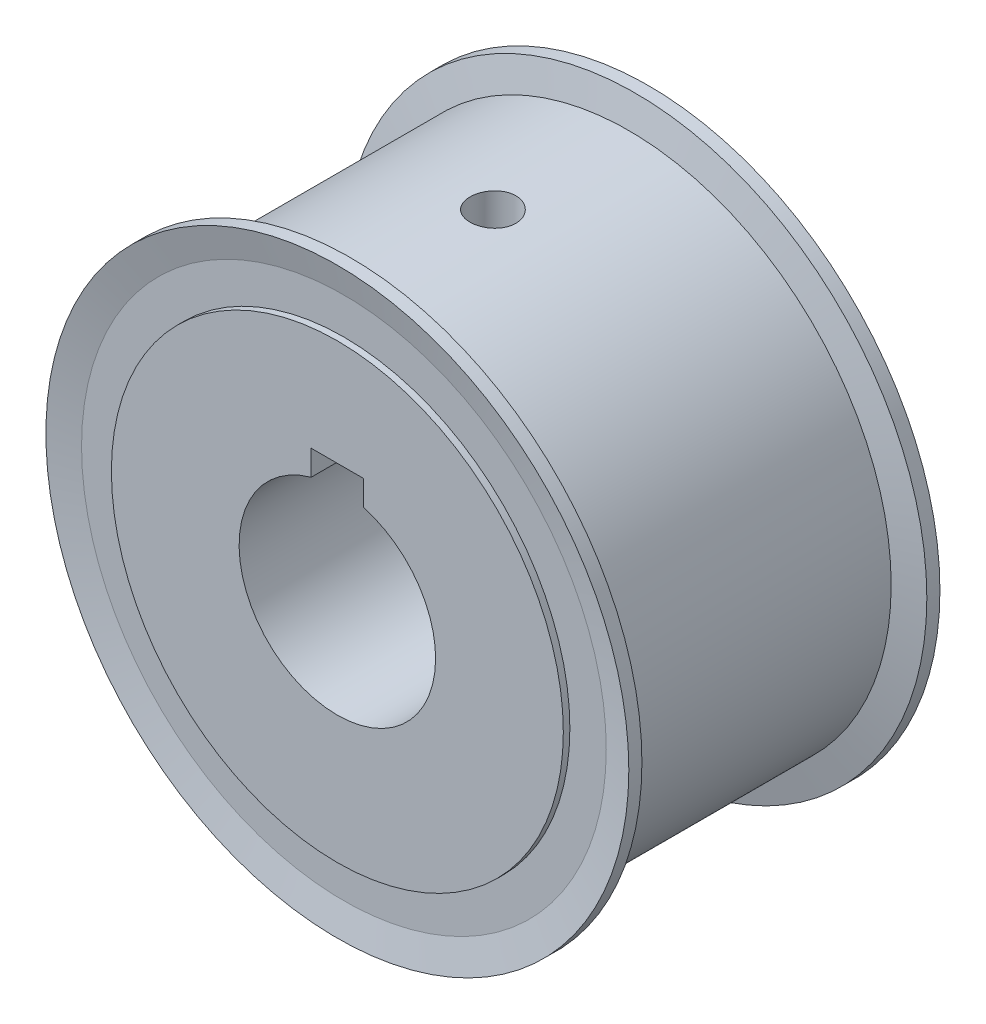
ISO-10303-21;
HEADER;
FILE_DESCRIPTION(('STEP AP214'),'2;1');
FILE_NAME('part.step','',(''),(''),'','','');
FILE_SCHEMA(('AUTOMOTIVE_DESIGN { 1 0 10303 214 1 1 1 1 }'));
ENDSEC;
DATA;
#1=APPLICATION_CONTEXT('core data for automotive mechanical design processes');
#2=APPLICATION_PROTOCOL_DEFINITION('international standard','automotive_design',2000,#1);
#3=PRODUCT_CONTEXT('',#1,'mechanical');
#4=PRODUCT('Part','Part','',(#3));
#5=PRODUCT_RELATED_PRODUCT_CATEGORY('part','',(#4));
#6=PRODUCT_DEFINITION_FORMATION('','',#4);
#7=PRODUCT_DEFINITION_CONTEXT('part definition',#1,'design');
#8=PRODUCT_DEFINITION('design','',#6,#7);
#9=PRODUCT_DEFINITION_SHAPE('','',#8);
#10=(LENGTH_UNIT() NAMED_UNIT(*) SI_UNIT(.MILLI.,.METRE.));
#11=(NAMED_UNIT(*) PLANE_ANGLE_UNIT() SI_UNIT($,.RADIAN.));
#12=(NAMED_UNIT(*) SI_UNIT($,.STERADIAN.) SOLID_ANGLE_UNIT());
#13=UNCERTAINTY_MEASURE_WITH_UNIT(LENGTH_MEASURE(1.E-05),#10,'distance_accuracy_value','');
#14=(GEOMETRIC_REPRESENTATION_CONTEXT(3) GLOBAL_UNCERTAINTY_ASSIGNED_CONTEXT((#13)) GLOBAL_UNIT_ASSIGNED_CONTEXT((#10,
#11,#12)) REPRESENTATION_CONTEXT('',''));
#15=CARTESIAN_POINT('',(0.,0.,0.));
#16=DIRECTION('',(0.,0.,1.));
#17=DIRECTION('',(1.,0.,0.));
#18=AXIS2_PLACEMENT_3D('',#15,#16,#17);
#19=CARTESIAN_POINT('',(-26.0283935107412,-15.0275000000001,23.75));
#20=DIRECTION('',(0.866025403784436,0.500000000000004,0.));
#21=DIRECTION('',(-0.500000000000004,0.866025403784436,0.));
#22=AXIS2_PLACEMENT_3D('',#19,#20,#21);
#23=PLANE('',#22);
#24=CARTESIAN_POINT('',(-26.0283935107412,-15.0275000000001,23.75));
#25=DIRECTION('',(-0.866025403784436,-0.500000000000004,0.));
#26=DIRECTION('',(0.500000000000004,-0.866025403784436,0.));
#27=AXIS2_PLACEMENT_3D('',#24,#25,#26);
#28=CIRCLE('',#27,3.5);
#29=CARTESIAN_POINT('',(-24.2783935107412,-18.0585889132456,23.75));
#30=VERTEX_POINT('',#29);
#31=EDGE_CURVE('E219',#30,#30,#28,.T.);
#32=ORIENTED_EDGE('',*,*,#31,.T.);
#33=EDGE_LOOP('',(#32));
#34=FACE_BOUND('',#33,.T.);
#35=CARTESIAN_POINT('',(-26.0283935107412,-15.0275000000001,23.75));
#36=DIRECTION('',(-0.866025403784436,-0.500000000000004,0.));
#37=DIRECTION('',(0.500000000000004,-0.866025403784436,0.));
#38=AXIS2_PLACEMENT_3D('',#35,#36,#37);
#39=CIRCLE('',#38,2.49999999999999);
#40=CARTESIAN_POINT('',(-24.7783935107412,-17.1925635094612,23.75));
#41=VERTEX_POINT('',#40);
#42=EDGE_CURVE('E220',#41,#41,#39,.T.);
#43=ORIENTED_EDGE('',*,*,#42,.F.);
#44=EDGE_LOOP('',(#43));
#45=FACE_BOUND('',#44,.T.);
#46=ADVANCED_FACE('F34',(#34,#45),#23,.F.);
#47=CARTESIAN_POINT('',(0.,30.055,23.75));
#48=DIRECTION('',(0.,-1.,0.));
#49=DIRECTION('',(0.,0.,-1.));
#50=AXIS2_PLACEMENT_3D('',#47,#48,#49);
#51=PLANE('',#50);
#52=CARTESIAN_POINT('',(0.,30.055,23.75));
#53=DIRECTION('',(0.,1.,0.));
#54=DIRECTION('',(0.,0.,1.));
#55=AXIS2_PLACEMENT_3D('',#52,#53,#54);
#56=CIRCLE('',#55,3.5);
#57=CARTESIAN_POINT('',(0.,30.055,27.25));
#58=VERTEX_POINT('',#57);
#59=EDGE_CURVE('E228',#58,#58,#56,.T.);
#60=ORIENTED_EDGE('',*,*,#59,.T.);
#61=EDGE_LOOP('',(#60));
#62=FACE_BOUND('',#61,.T.);
#63=CARTESIAN_POINT('',(0.,30.055,23.75));
#64=DIRECTION('',(0.,1.,0.));
#65=DIRECTION('',(0.,0.,1.));
#66=AXIS2_PLACEMENT_3D('',#63,#64,#65);
#67=CIRCLE('',#66,2.49999999999999);
#68=CARTESIAN_POINT('',(0.,30.055,26.25));
#69=VERTEX_POINT('',#68);
#70=EDGE_CURVE('E222',#69,#69,#67,.T.);
#71=ORIENTED_EDGE('',*,*,#70,.F.);
#72=EDGE_LOOP('',(#71));
#73=FACE_BOUND('',#72,.T.);
#74=ADVANCED_FACE('F157',(#62,#73),#51,.F.);
#75=CARTESIAN_POINT('',(0.,34.5,47.5));
#76=DIRECTION('',(0.,0.,-1.));
#77=DIRECTION('',(-1.,0.,0.));
#78=AXIS2_PLACEMENT_3D('',#75,#76,#77);
#79=PLANE('',#78);
#80=CARTESIAN_POINT('',(0.,0.,47.5));
#81=DIRECTION('',(0.,0.,-1.));
#82=DIRECTION('',(-1.,0.,0.));
#83=AXIS2_PLACEMENT_3D('',#80,#81,#82);
#84=CIRCLE('',#83,15.);
#85=CARTESIAN_POINT('',(4.,14.456832294801,47.5));
#86=VERTEX_POINT('',#85);
#87=CARTESIAN_POINT('',(-4.,14.456832294801,47.5));
#88=VERTEX_POINT('',#87);
#89=EDGE_CURVE('E102',#86,#88,#84,.T.);
#90=ORIENTED_EDGE('',*,*,#89,.T.);
#91=DIRECTION('',(0.,-1.,0.));
#92=VECTOR('',#91,1.);
#93=CARTESIAN_POINT('',(-4.,18.3,47.5));
#94=LINE('',#93,#92);
#95=CARTESIAN_POINT('',(-4.,18.3,47.5));
#96=VERTEX_POINT('',#95);
#97=EDGE_CURVE('E85',#96,#88,#94,.T.);
#98=ORIENTED_EDGE('',*,*,#97,.F.);
#99=DIRECTION('',(-1.,0.,0.));
#100=VECTOR('',#99,1.);
#101=CARTESIAN_POINT('',(-4.,18.3,47.5));
#102=LINE('',#101,#100);
#103=CARTESIAN_POINT('',(4.,18.3,47.5));
#104=VERTEX_POINT('',#103);
#105=EDGE_CURVE('E98',#104,#96,#102,.T.);
#106=ORIENTED_EDGE('',*,*,#105,.F.);
#107=DIRECTION('',(0.,1.,0.));
#108=VECTOR('',#107,1.);
#109=CARTESIAN_POINT('',(4.,18.3,47.5));
#110=LINE('',#109,#108);
#111=EDGE_CURVE('E234',#86,#104,#110,.T.);
#112=ORIENTED_EDGE('',*,*,#111,.F.);
#113=EDGE_LOOP('',(#90,#98,#106,#112));
#114=FACE_BOUND('',#113,.T.);
#115=CARTESIAN_POINT('',(0.,0.,47.5));
#116=DIRECTION('',(0.,0.,1.));
#117=DIRECTION('',(1.,0.,0.));
#118=AXIS2_PLACEMENT_3D('',#115,#116,#117);
#119=CIRCLE('',#118,34.5);
#120=CARTESIAN_POINT('',(34.5,0.,47.5));
#121=VERTEX_POINT('',#120);
#122=EDGE_CURVE('E101',#121,#121,#119,.T.);
#123=ORIENTED_EDGE('',*,*,#122,.T.);
#124=EDGE_LOOP('',(#123));
#125=FACE_BOUND('',#124,.T.);
#126=ADVANCED_FACE('F36',(#114,#125),#79,.F.);
#127=CARTESIAN_POINT('',(0.,34.5,0.));
#128=DIRECTION('',(0.,0.,1.));
#129=DIRECTION('',(1.,0.,0.));
#130=AXIS2_PLACEMENT_3D('',#127,#128,#129);
#131=PLANE('',#130);
#132=DIRECTION('',(-1.,0.,0.));
#133=VECTOR('',#132,1.);
#134=CARTESIAN_POINT('',(-4.,18.3,0.));
#135=LINE('',#134,#133);
#136=CARTESIAN_POINT('',(4.,18.3,0.));
#137=VERTEX_POINT('',#136);
#138=CARTESIAN_POINT('',(-4.,18.3,0.));
#139=VERTEX_POINT('',#138);
#140=EDGE_CURVE('E91',#137,#139,#135,.T.);
#141=ORIENTED_EDGE('',*,*,#140,.T.);
#142=DIRECTION('',(0.,-1.,0.));
#143=VECTOR('',#142,1.);
#144=CARTESIAN_POINT('',(-4.,18.3,0.));
#145=LINE('',#144,#143);
#146=CARTESIAN_POINT('',(-4.,14.456832294801,0.));
#147=VERTEX_POINT('',#146);
#148=EDGE_CURVE('E82',#139,#147,#145,.T.);
#149=ORIENTED_EDGE('',*,*,#148,.T.);
#150=CARTESIAN_POINT('',(0.,0.,0.));
#151=DIRECTION('',(0.,0.,-1.));
#152=DIRECTION('',(-1.,0.,0.));
#153=AXIS2_PLACEMENT_3D('',#150,#151,#152);
#154=CIRCLE('',#153,15.);
#155=CARTESIAN_POINT('',(4.,14.456832294801,0.));
#156=VERTEX_POINT('',#155);
#157=EDGE_CURVE('E97',#156,#147,#154,.T.);
#158=ORIENTED_EDGE('',*,*,#157,.F.);
#159=DIRECTION('',(0.,1.,0.));
#160=VECTOR('',#159,1.);
#161=CARTESIAN_POINT('',(4.,18.3,0.));
#162=LINE('',#161,#160);
#163=EDGE_CURVE('E53',#156,#137,#162,.T.);
#164=ORIENTED_EDGE('',*,*,#163,.T.);
#165=EDGE_LOOP('',(#141,#149,#158,#164));
#166=FACE_BOUND('',#165,.T.);
#167=CARTESIAN_POINT('',(0.,0.,0.));
#168=DIRECTION('',(0.,0.,1.));
#169=DIRECTION('',(1.,0.,0.));
#170=AXIS2_PLACEMENT_3D('',#167,#168,#169);
#171=CIRCLE('',#170,34.5);
#172=CARTESIAN_POINT('',(34.5,0.,0.));
#173=VERTEX_POINT('',#172);
#174=EDGE_CURVE('E138',#173,#173,#171,.T.);
#175=ORIENTED_EDGE('',*,*,#174,.F.);
#176=EDGE_LOOP('',(#175));
#177=FACE_BOUND('',#176,.T.);
#178=ADVANCED_FACE('F95',(#166,#177),#131,.F.);
#179=CARTESIAN_POINT('',(0.,0.,52.8569404790386));
#180=DIRECTION('',(0.,0.,1.));
#181=DIRECTION('',(1.,0.,0.));
#182=AXIS2_PLACEMENT_3D('',#179,#180,#181);
#183=CYLINDRICAL_SURFACE('',#182,34.5);
#184=CARTESIAN_POINT('',(0.,0.,1.));
#185=DIRECTION('',(0.,0.,1.));
#186=DIRECTION('',(1.,0.,0.));
#187=AXIS2_PLACEMENT_3D('',#184,#185,#186);
#188=CIRCLE('',#187,34.5);
#189=CARTESIAN_POINT('',(34.5,0.,1.));
#190=VERTEX_POINT('',#189);
#191=EDGE_CURVE('E135',#190,#190,#188,.T.);
#192=ORIENTED_EDGE('',*,*,#191,.F.);
#193=EDGE_LOOP('',(#192));
#194=FACE_BOUND('',#193,.T.);
#195=ORIENTED_EDGE('',*,*,#174,.T.);
#196=EDGE_LOOP('',(#195));
#197=FACE_BOUND('',#196,.T.);
#198=ADVANCED_FACE('F257',(#194,#197),#183,.T.);
#199=CARTESIAN_POINT('',(0.,40.055,1.));
#200=DIRECTION('',(0.,0.,1.));
#201=DIRECTION('',(1.,0.,0.));
#202=AXIS2_PLACEMENT_3D('',#199,#200,#201);
#203=PLANE('',#202);
#204=CARTESIAN_POINT('',(0.,0.,1.));
#205=DIRECTION('',(0.,0.,1.));
#206=DIRECTION('',(1.,0.,0.));
#207=AXIS2_PLACEMENT_3D('',#204,#205,#206);
#208=CIRCLE('',#207,40.055);
#209=CARTESIAN_POINT('',(40.055,0.,1.));
#210=VERTEX_POINT('',#209);
#211=EDGE_CURVE('E132',#210,#210,#208,.T.);
#212=ORIENTED_EDGE('',*,*,#211,.F.);
#213=EDGE_LOOP('',(#212));
#214=FACE_BOUND('',#213,.T.);
#215=ORIENTED_EDGE('',*,*,#191,.T.);
#216=EDGE_LOOP('',(#215));
#217=FACE_BOUND('',#216,.T.);
#218=ADVANCED_FACE('F261',(#214,#217),#203,.F.);
#219=CARTESIAN_POINT('',(0.,0.,1.));
#220=DIRECTION('',(0.,0.,-1.));
#221=DIRECTION('',(-1.,0.,0.));
#222=AXIS2_PLACEMENT_3D('',#219,#220,#221);
#223=CONICAL_SURFACE('',#222,40.055,1.34950865104239);
#224=CARTESIAN_POINT('',(0.,0.,0.));
#225=DIRECTION('',(0.,0.,1.));
#226=DIRECTION('',(1.,0.,0.));
#227=AXIS2_PLACEMENT_3D('',#224,#225,#226);
#228=CIRCLE('',#227,44.5);
#229=CARTESIAN_POINT('',(44.5,0.,0.));
#230=VERTEX_POINT('',#229);
#231=EDGE_CURVE('E129',#230,#230,#228,.T.);
#232=ORIENTED_EDGE('',*,*,#231,.F.);
#233=EDGE_LOOP('',(#232));
#234=FACE_BOUND('',#233,.T.);
#235=ORIENTED_EDGE('',*,*,#211,.T.);
#236=EDGE_LOOP('',(#235));
#237=FACE_BOUND('',#236,.T.);
#238=ADVANCED_FACE('F267',(#234,#237),#223,.F.);
#239=CARTESIAN_POINT('',(0.,0.,52.8569404790386));
#240=DIRECTION('',(0.,0.,1.));
#241=DIRECTION('',(1.,0.,0.));
#242=AXIS2_PLACEMENT_3D('',#239,#240,#241);
#243=CYLINDRICAL_SURFACE('',#242,44.5);
#244=CARTESIAN_POINT('',(0.,0.,2.));
#245=DIRECTION('',(0.,0.,1.));
#246=DIRECTION('',(1.,0.,0.));
#247=AXIS2_PLACEMENT_3D('',#244,#245,#246);
#248=CIRCLE('',#247,44.5);
#249=CARTESIAN_POINT('',(44.5,0.,2.));
#250=VERTEX_POINT('',#249);
#251=EDGE_CURVE('E126',#250,#250,#248,.T.);
#252=ORIENTED_EDGE('',*,*,#251,.F.);
#253=EDGE_LOOP('',(#252));
#254=FACE_BOUND('',#253,.T.);
#255=ORIENTED_EDGE('',*,*,#231,.T.);
#256=EDGE_LOOP('',(#255));
#257=FACE_BOUND('',#256,.T.);
#258=ADVANCED_FACE('F271',(#254,#257),#243,.T.);
#259=CARTESIAN_POINT('',(0.,0.,2.));
#260=DIRECTION('',(0.,0.,-1.));
#261=DIRECTION('',(-1.,0.,0.));
#262=AXIS2_PLACEMENT_3D('',#259,#260,#261);
#263=CONICAL_SURFACE('',#262,44.5,1.34950865104239);
#264=CARTESIAN_POINT('',(0.,0.,3.));
#265=DIRECTION('',(0.,0.,1.));
#266=DIRECTION('',(1.,0.,0.));
#267=AXIS2_PLACEMENT_3D('',#264,#265,#266);
#268=CIRCLE('',#267,40.055);
#269=CARTESIAN_POINT('',(40.055,0.,3.));
#270=VERTEX_POINT('',#269);
#271=EDGE_CURVE('E123',#270,#270,#268,.T.);
#272=ORIENTED_EDGE('',*,*,#271,.F.);
#273=EDGE_LOOP('',(#272));
#274=FACE_BOUND('',#273,.T.);
#275=ORIENTED_EDGE('',*,*,#251,.T.);
#276=EDGE_LOOP('',(#275));
#277=FACE_BOUND('',#276,.T.);
#278=ADVANCED_FACE('F193',(#274,#277),#263,.T.);
#279=CARTESIAN_POINT('',(0.,0.,52.8569404790386));
#280=DIRECTION('',(0.,0.,1.));
#281=DIRECTION('',(1.,0.,0.));
#282=AXIS2_PLACEMENT_3D('',#279,#280,#281);
#283=CYLINDRICAL_SURFACE('',#282,40.055);
#284=CARTESIAN_POINT('',(-32.80596574761,-22.9819850397358,23.75));
#285=CARTESIAN_POINT('',(-32.8059717786235,-22.9819786432278,23.553806520305));
#286=CARTESIAN_POINT('',(-32.815508394242,-22.9683818484388,23.3574803431471));
#287=CARTESIAN_POINT('',(-32.8533061019263,-22.9142826619368,22.9702625894534));
#288=CARTESIAN_POINT('',(-32.8815882789119,-22.8737499727209,22.7793773853586));
#289=CARTESIAN_POINT('',(-32.955740739866,-22.7667825362345,22.4087056791033));
#290=CARTESIAN_POINT('',(-33.0016008961903,-22.700362703606,22.2289128551321));
#291=CARTESIAN_POINT('',(-33.1091148851442,-22.5432595972545,21.8854248458655));
#292=CARTESIAN_POINT('',(-33.1707653955218,-22.452581427248,21.7217262843903));
#293=CARTESIAN_POINT('',(-33.3077099727427,-22.2489220439223,21.4145718856317));
#294=CARTESIAN_POINT('',(-33.3830376650998,-22.1358858004051,21.2711675234144));
#295=CARTESIAN_POINT('',(-33.5444808846166,-21.8904626832845,21.0091147256924));
#296=CARTESIAN_POINT('',(-33.6305968877928,-21.7580749557854,20.8904673831669));
#297=CARTESIAN_POINT('',(-33.8107281338238,-21.4770933596427,20.6811235292922));
#298=CARTESIAN_POINT('',(-33.9047557389747,-21.3284740160772,20.5904718348179));
#299=CARTESIAN_POINT('',(-34.097407909731,-21.0191096116076,20.4399792172312));
#300=CARTESIAN_POINT('',(-34.1960323877068,-20.8583647818141,20.3801377070495));
#301=CARTESIAN_POINT('',(-34.3944439044734,-20.5295400015305,20.2931130777752));
#302=CARTESIAN_POINT('',(-34.4942272988422,-20.3614799895973,20.2658463204221));
#303=CARTESIAN_POINT('',(-34.6921851586057,-20.022333986653,20.2444865915869));
#304=CARTESIAN_POINT('',(-34.7903596565515,-19.8512480570078,20.2503929481179));
#305=CARTESIAN_POINT('',(-34.9820721930106,-19.5114227620504,20.2951435023052));
#306=CARTESIAN_POINT('',(-35.0756221542238,-19.3426782667891,20.3338977609611));
#307=CARTESIAN_POINT('',(-35.2559686991743,-19.0119750106855,20.4431041207878));
#308=CARTESIAN_POINT('',(-35.342765213252,-18.8500163198445,20.5135565488639));
#309=CARTESIAN_POINT('',(-35.5076955051724,-18.5374724450026,20.6842592328285));
#310=CARTESIAN_POINT('',(-35.5858174083991,-18.3869029392594,20.7845496597134));
#311=CARTESIAN_POINT('',(-35.7316290834878,-18.101916250953,21.0120522973215));
#312=CARTESIAN_POINT('',(-35.7993186223172,-17.9674994292145,21.1392651092716));
#313=CARTESIAN_POINT('',(-35.9232022302373,-17.7185216865187,21.4175080703633));
#314=CARTESIAN_POINT('',(-35.9793571282736,-17.6040286203667,21.5686163907751));
#315=CARTESIAN_POINT('',(-36.0789286685636,-17.3990505021577,21.8900888502207));
#316=CARTESIAN_POINT('',(-36.1223452987356,-17.308565472871,22.0604530075175));
#317=CARTESIAN_POINT('',(-36.195767112707,-17.1544976129405,22.4156573154005));
#318=CARTESIAN_POINT('',(-36.2257704008454,-17.090918584896,22.6004995077817));
#319=CARTESIAN_POINT('',(-36.2719154320454,-16.9927673797377,22.9793858567227));
#320=CARTESIAN_POINT('',(-36.2880574959564,-16.9581945312104,23.1734298001774));
#321=CARTESIAN_POINT('',(-36.3062233324763,-16.9192683452595,23.5645253576344));
#322=CARTESIAN_POINT('',(-36.3082935594854,-16.9148155747022,23.7615649209949));
#323=CARTESIAN_POINT('',(-36.2984104160125,-16.9360136305501,24.153661129507));
#324=CARTESIAN_POINT('',(-36.2864571895543,-16.9616641477883,24.3487177950025));
#325=CARTESIAN_POINT('',(-36.2487240228112,-17.042153087416,24.7309962832855));
#326=CARTESIAN_POINT('',(-36.2229660643406,-17.0969451056003,24.91823005324));
#327=CARTESIAN_POINT('',(-36.1580061992833,-17.2339004158932,25.2799182445754));
#328=CARTESIAN_POINT('',(-36.1188040559442,-17.3160641900182,25.4543724408421));
#329=CARTESIAN_POINT('',(-36.0274299216028,-17.5053806782556,25.786049267274));
#330=CARTESIAN_POINT('',(-35.9752243562673,-17.6125980347072,25.9432257487509));
#331=CARTESIAN_POINT('',(-35.8587553603285,-17.8485279781856,26.2354187117788));
#332=CARTESIAN_POINT('',(-35.7944917017468,-17.9772409716183,26.3704347742596));
#333=CARTESIAN_POINT('',(-35.6548835657263,-18.2525654564549,26.6148483691287));
#334=CARTESIAN_POINT('',(-35.5795092511139,-18.3992249564239,26.7241747957997));
#335=CARTESIAN_POINT('',(-35.4193490382875,-18.7056833659984,26.9136175410774));
#336=CARTESIAN_POINT('',(-35.3345632421424,-18.8654821331018,26.9937341764283));
#337=CARTESIAN_POINT('',(-35.1576337187789,-19.1931866267193,27.1223613758143));
#338=CARTESIAN_POINT('',(-35.0655003734094,-19.361080786499,27.1709156782745));
#339=CARTESIAN_POINT('',(-34.8760949463635,-19.7002215999761,27.2351828398488));
#340=CARTESIAN_POINT('',(-34.7788229726435,-19.8714681831956,27.2508963886273));
#341=CARTESIAN_POINT('',(-34.5821507306926,-20.2117880135438,27.2490275839308));
#342=CARTESIAN_POINT('',(-34.4827586295846,-20.3808665994154,27.231555946664));
#343=CARTESIAN_POINT('',(-34.2844690276536,-20.7126912939972,27.1640438976544));
#344=CARTESIAN_POINT('',(-34.1855715274458,-20.8754373948335,27.1140034454165));
#345=CARTESIAN_POINT('',(-33.9913859492601,-21.1901610106949,26.9828029719464));
#346=CARTESIAN_POINT('',(-33.8960976067405,-21.3421393156844,26.9016452363972));
#347=CARTESIAN_POINT('',(-33.7122730330013,-21.6313445954075,26.7105263897741));
#348=CARTESIAN_POINT('',(-33.6237367103657,-21.7685717698678,26.6005656687552));
#349=CARTESIAN_POINT('',(-33.4562032167059,-22.0251921685666,26.3545464751038));
#350=CARTESIAN_POINT('',(-33.3772373645831,-22.1445271281879,26.2184058996433));
#351=CARTESIAN_POINT('',(-33.2320122441175,-22.3618765300853,25.9240439366185));
#352=CARTESIAN_POINT('',(-33.1657560509849,-22.459885813201,25.7658172210844));
#353=CARTESIAN_POINT('',(-33.0483420892936,-22.6323009563495,25.4314377311704));
#354=CARTESIAN_POINT('',(-32.9972151240475,-22.7066586842242,25.2552493533699));
#355=CARTESIAN_POINT('',(-32.9122762296052,-22.8296021347531,24.8903249113287));
#356=CARTESIAN_POINT('',(-32.8784444795334,-22.8782173614445,24.7016034920107));
#357=CARTESIAN_POINT('',(-32.8380102082563,-22.9361904715862,24.3848154680584));
#358=CARTESIAN_POINT('',(-32.8260147946796,-22.9533434559431,24.2587836757226));
#359=CARTESIAN_POINT('',(-32.8099906147966,-22.9762428032755,24.0051866354448));
#360=CARTESIAN_POINT('',(-32.8059618245115,-22.9819892005839,23.8776213921196));
#361=CARTESIAN_POINT('',(-32.80596574761,-22.9819850397358,23.75));
#362=B_SPLINE_CURVE_WITH_KNOTS('',3,(#284,#285,#286,#287,#288,#289,#290,#291,#292,#293,#294,
#295,#296,#297,#298,#299,#300,#301,#302,#303,#304,#305,#306,#307,#308,#309,#310,#311,#312,#313,
#314,#315,#316,#317,#318,#319,#320,#321,#322,#323,#324,#325,#326,#327,#328,#329,#330,#331,#332,
#333,#334,#335,#336,#337,#338,#339,#340,#341,#342,#343,#344,#345,#346,#347,#348,#349,#350,#351,
#352,#353,#354,#355,#356,#357,#358,#359,#360,#361),.UNSPECIFIED.,.T.,.F.,(4,2,2,2,2,2,2,2,2,2,2,
2,2,2,2,2,2,2,2,2,2,2,2,2,2,2,2,2,2,2,2,2,2,2,2,2,2,2,4),(0.,0.588114451442172,1.17689153641607,
1.76532990308698,2.35364456532047,2.94342568816245,3.53323284330667,4.12397935545634,
4.71471461087383,5.30392982430115,5.89313310205305,6.48072830744088,7.06832957287399,
7.65672553547558,8.24513463944476,8.83551006738781,9.42588605526835,10.0163454525774,
10.6067911819933,11.195286762252,11.783776298593,12.3713315321509,12.9588971131025,
13.5479957836067,14.1371055931271,14.727827268104,15.3185425372446,15.908437450393,
16.4983199754716,17.0862379233888,17.6741566023088,18.2620321046322,18.8498996462552,
19.4396417902488,20.029526447884,20.6206039832322,21.2110025974347,21.5935648061716,
21.9761258634267),.UNSPECIFIED.);
#363=CARTESIAN_POINT('',(-32.80596574761,-22.9819850397358,23.75));
#364=VERTEX_POINT('',#363);
#365=EDGE_CURVE('E11',#364,#364,#362,.T.);
#366=ORIENTED_EDGE('',*,*,#365,.T.);
#367=EDGE_LOOP('',(#366));
#368=FACE_BOUND('',#367,.T.);
#369=CARTESIAN_POINT('',(0.,40.055,27.25));
#370=CARTESIAN_POINT('',(-0.196195091913983,40.0549980035695,27.2499914464052));
#371=CARTESIAN_POINT('',(-0.392522876083729,40.053543157102,27.2334477061984));
#372=CARTESIAN_POINT('',(-0.779743968807647,40.0478793688906,27.1676964441643));
#373=CARTESIAN_POINT('',(-0.970630906181819,40.0436673264563,27.1184521470103));
#374=CARTESIAN_POINT('',(-1.34130627711322,40.0329650107293,26.9887368536928));
#375=CARTESIAN_POINT('',(-1.52110101780322,40.0264760464205,26.9082837963965));
#376=CARTESIAN_POINT('',(-1.86459223730481,40.0119471087442,26.7184674782124));
#377=CARTESIAN_POINT('',(-2.02829209469687,40.0039074619445,26.6091103026272));
#378=CARTESIAN_POINT('',(-2.33544502461648,39.9871539055789,26.3642614714731));
#379=CARTESIAN_POINT('',(-2.47884703385911,39.9784383779752,26.2287058640499));
#380=CARTESIAN_POINT('',(-2.7408952918844,39.9613288852561,25.9354435817762));
#381=CARTESIAN_POINT('',(-2.85954044047289,39.952934934445,25.7777359230102));
#382=CARTESIAN_POINT('',(-3.0688820044522,39.9374018246309,25.4443343892415));
#383=CARTESIAN_POINT('',(-3.15953319883226,39.9302647038008,25.2686120170434));
#384=CARTESIAN_POINT('',(-3.31002476967342,39.9180722841311,24.9043675362292));
#385=CARTESIAN_POINT('',(-3.36986573916652,39.9130169452221,24.7158456740553));
#386=CARTESIAN_POINT('',(-3.45688923223841,39.905574350721,24.3318677418437));
#387=CARTESIAN_POINT('',(-3.48415534896616,39.9031802669561,24.1364307516151));
#388=CARTESIAN_POINT('',(-3.50551343161705,39.9013097721972,23.7437407068067));
#389=CARTESIAN_POINT('',(-3.49960607641087,39.9018333014964,23.546487689473));
#390=CARTESIAN_POINT('',(-3.45485394596231,39.9057326673437,23.1563385003557));
#391=CARTESIAN_POINT('',(-3.41610011487456,39.9091006282393,22.9634318070781));
#392=CARTESIAN_POINT('',(-3.30689645162769,39.9182970321075,22.5868715070693));
#393=CARTESIAN_POINT('',(-3.23644628293893,39.924125501204,22.4032179986049));
#394=CARTESIAN_POINT('',(-3.06574826713897,39.9375952651673,22.0500880674758));
#395=CARTESIAN_POINT('',(-2.96545972021031,39.9452390332258,21.8806314166929));
#396=CARTESIAN_POINT('',(-2.73796108962057,39.9614758979904,21.5609217047501));
#397=CARTESIAN_POINT('',(-2.61075040575157,39.9700690158594,21.4106690718485));
#398=CARTESIAN_POINT('',(-2.33250894803874,39.9872714030673,21.1331037957159));
#399=CARTESIAN_POINT('',(-2.18139956999274,39.9958806296535,21.0058699322082));
#400=CARTESIAN_POINT('',(-1.85992410214172,40.0121177392272,20.7785633437436));
#401=CARTESIAN_POINT('',(-1.68955799772269,40.01974562147,20.6784906393997));
#402=CARTESIAN_POINT('',(-1.33435317534095,40.0331622658078,20.5083515756488));
#403=CARTESIAN_POINT('',(-1.1495127222482,40.0389508069876,20.438288820254));
#404=CARTESIAN_POINT('',(-0.770630151931283,40.0480340991053,20.3302142182351));
#405=CARTESIAN_POINT('',(-0.576588244798591,40.0513289069521,20.2922016401998));
#406=CARTESIAN_POINT('',(-0.185493613972502,40.0550461933334,20.2494054666245));
#407=CARTESIAN_POINT('',(0.0115471194759136,40.0554780757476,20.2445130797368));
#408=CARTESIAN_POINT('',(0.403645923510567,40.0534459885363,20.2678110021149));
#409=CARTESIAN_POINT('',(0.59870401443846,40.0509820486519,20.2960009716137));
#410=CARTESIAN_POINT('',(0.980989488495527,40.0434414055186,20.3845732074668));
#411=CARTESIAN_POINT('',(1.16822866960278,40.0383688047786,20.4449049314504));
#412=CARTESIAN_POINT('',(1.52992703452426,40.0261805026754,20.5959963855795));
#413=CARTESIAN_POINT('',(1.70438599684771,40.0190647659137,20.6867566429223));
#414=CARTESIAN_POINT('',(2.03606603940723,40.0035640271791,20.8964013936464));
#415=CARTESIAN_POINT('',(2.19324149676179,39.995175798691,21.0153578249356));
#416=CARTESIAN_POINT('',(2.48543206981567,39.9780829424773,21.2779144447657));
#417=CARTESIAN_POINT('',(2.62044676199094,39.9693783087087,21.421515104186));
#418=CARTESIAN_POINT('',(2.86485744027774,39.9526057642994,21.7297565656509));
#419=CARTESIAN_POINT('',(2.97418234056156,39.9445396604355,21.8944538450262));
#420=CARTESIAN_POINT('',(3.16362240684723,39.9299835176486,22.2399328553339));
#421=CARTESIAN_POINT('',(3.24373788924878,39.9234934616538,22.4207144120132));
#422=CARTESIAN_POINT('',(3.37236431636771,39.9128346824393,22.792980341534));
#423=CARTESIAN_POINT('',(3.42091850009857,39.9086627844837,22.9844496796788));
#424=CARTESIAN_POINT('',(3.48518472672618,39.9031022523147,23.3728612897795));
#425=CARTESIAN_POINT('',(3.5008974702538,39.9017135587252,23.5698034448889));
#426=CARTESIAN_POINT('',(3.49902633524599,39.9018776307166,23.9628637668256));
#427=CARTESIAN_POINT('',(3.48155414094391,39.9034205299998,24.1589824790814));
#428=CARTESIAN_POINT('',(3.41404227642055,39.9092529630346,24.5454883793592));
#429=CARTESIAN_POINT('',(3.36400255915971,39.9135425007532,24.7358755591023));
#430=CARTESIAN_POINT('',(3.23280497931036,39.9243822612601,25.1055193884438));
#431=CARTESIAN_POINT('',(3.15164942767604,39.9309323161575,25.2847768634902));
#432=CARTESIAN_POINT('',(2.9605361142672,39.9455553880662,25.6271416438669));
#433=CARTESIAN_POINT('',(2.85057873839468,39.953628384672,25.7902491655424));
#434=CARTESIAN_POINT('',(2.60456320326951,39.9704201006164,26.0962559129046));
#435=CARTESIAN_POINT('',(2.46842217755974,39.97914081459,26.2390884085132));
#436=CARTESIAN_POINT('',(2.17405830352158,39.9962271117973,26.4999358310107));
#437=CARTESIAN_POINT('',(2.01583013269727,40.0045926087961,26.6179447587536));
#438=CARTESIAN_POINT('',(1.68144947781427,40.0200424951199,26.8259700874482));
#439=CARTESIAN_POINT('',(1.50526165143474,40.0271242791412,26.9159298228738));
#440=CARTESIAN_POINT('',(1.14033838327123,40.0391788750584,27.0648726430828));
#441=CARTESIAN_POINT('',(0.951617582959853,40.0441540994661,27.1238911814583));
#442=CARTESIAN_POINT('',(0.634827838515019,40.0501638969456,27.194316328098));
#443=CARTESIAN_POINT('',(0.508793577602792,40.0519691343877,27.215169776203));
#444=CARTESIAN_POINT('',(0.255191590705968,40.0543878334788,27.2430143736025));
#445=CARTESIAN_POINT('',(0.12762386927691,40.0550012986675,27.2500055640681));
#446=CARTESIAN_POINT('',(0.,40.055,27.25));
#447=B_SPLINE_CURVE_WITH_KNOTS('',3,(#369,#370,#371,#372,#373,#374,#375,#376,#377,#378,#379,
#380,#381,#382,#383,#384,#385,#386,#387,#388,#389,#390,#391,#392,#393,#394,#395,#396,#397,#398,
#399,#400,#401,#402,#403,#404,#405,#406,#407,#408,#409,#410,#411,#412,#413,#414,#415,#416,#417,
#418,#419,#420,#421,#422,#423,#424,#425,#426,#427,#428,#429,#430,#431,#432,#433,#434,#435,#436,
#437,#438,#439,#440,#441,#442,#443,#444,#445,#446),.UNSPECIFIED.,.T.,.F.,(4,2,2,2,2,2,2,2,2,2,2,
2,2,2,2,2,2,2,2,2,2,2,2,2,2,2,2,2,2,2,2,2,2,2,2,2,2,2,4),(0.,0.588119293925899,1.17690111452599,
1.76534500227311,2.35366510106186,2.94343988751842,3.53324087796979,4.12398969946208,
4.71472714985746,5.30394537901664,5.8931515503027,6.48073165774915,7.06831800385914,
7.65670952637832,8.24511416800725,8.8354959736911,9.42587822742143,10.0163313625999,
10.6067710227884,11.195270294811,11.7837635228004,12.3713340747038,12.9589148072376,
13.5480111053385,14.1371186606054,14.7278376200775,15.3185501806254,15.908451749081,
16.4983407325995,17.0862479561869,17.6741560289318,18.2620204465552,18.8498769880645,
19.4396255483054,20.0295164705652,20.6205914941205,21.2109877531029,21.5935573784683,
21.9761258675931),.UNSPECIFIED.);
#448=CARTESIAN_POINT('',(0.,40.055,27.25));
#449=VERTEX_POINT('',#448);
#450=EDGE_CURVE('E46',#449,#449,#447,.T.);
#451=ORIENTED_EDGE('',*,*,#450,.T.);
#452=EDGE_LOOP('',(#451));
#453=FACE_BOUND('',#452,.T.);
#454=CARTESIAN_POINT('',(0.,0.,44.5));
#455=DIRECTION('',(0.,0.,1.));
#456=DIRECTION('',(1.,0.,0.));
#457=AXIS2_PLACEMENT_3D('',#454,#455,#456);
#458=CIRCLE('',#457,40.055);
#459=CARTESIAN_POINT('',(40.055,0.,44.5));
#460=VERTEX_POINT('',#459);
#461=EDGE_CURVE('E120',#460,#460,#458,.T.);
#462=ORIENTED_EDGE('',*,*,#461,.F.);
#463=EDGE_LOOP('',(#462));
#464=FACE_BOUND('',#463,.T.);
#465=ORIENTED_EDGE('',*,*,#271,.T.);
#466=EDGE_LOOP('',(#465));
#467=FACE_BOUND('',#466,.T.);
#468=ADVANCED_FACE('F144',(#368,#453,#464,#467),#283,.T.);
#469=CARTESIAN_POINT('',(0.,0.,44.5));
#470=DIRECTION('',(0.,0.,1.));
#471=DIRECTION('',(1.,0.,0.));
#472=AXIS2_PLACEMENT_3D('',#469,#470,#471);
#473=CONICAL_SURFACE('',#472,40.055,1.34950865104239);
#474=CARTESIAN_POINT('',(0.,0.,45.5));
#475=DIRECTION('',(0.,0.,1.));
#476=DIRECTION('',(1.,0.,0.));
#477=AXIS2_PLACEMENT_3D('',#474,#475,#476);
#478=CIRCLE('',#477,44.5);
#479=CARTESIAN_POINT('',(44.5,0.,45.5));
#480=VERTEX_POINT('',#479);
#481=EDGE_CURVE('E117',#480,#480,#478,.T.);
#482=ORIENTED_EDGE('',*,*,#481,.F.);
#483=EDGE_LOOP('',(#482));
#484=FACE_BOUND('',#483,.T.);
#485=ORIENTED_EDGE('',*,*,#461,.T.);
#486=EDGE_LOOP('',(#485));
#487=FACE_BOUND('',#486,.T.);
#488=ADVANCED_FACE('F186',(#484,#487),#473,.T.);
#489=CARTESIAN_POINT('',(0.,0.,52.8569404790386));
#490=DIRECTION('',(0.,0.,1.));
#491=DIRECTION('',(1.,0.,0.));
#492=AXIS2_PLACEMENT_3D('',#489,#490,#491);
#493=CYLINDRICAL_SURFACE('',#492,44.5);
#494=CARTESIAN_POINT('',(0.,0.,47.5));
#495=DIRECTION('',(0.,0.,1.));
#496=DIRECTION('',(1.,0.,0.));
#497=AXIS2_PLACEMENT_3D('',#494,#495,#496);
#498=CIRCLE('',#497,44.5);
#499=CARTESIAN_POINT('',(44.5,0.,47.5));
#500=VERTEX_POINT('',#499);
#501=EDGE_CURVE('E114',#500,#500,#498,.T.);
#502=ORIENTED_EDGE('',*,*,#501,.F.);
#503=EDGE_LOOP('',(#502));
#504=FACE_BOUND('',#503,.T.);
#505=ORIENTED_EDGE('',*,*,#481,.T.);
#506=EDGE_LOOP('',(#505));
#507=FACE_BOUND('',#506,.T.);
#508=ADVANCED_FACE('F183',(#504,#507),#493,.T.);
#509=CARTESIAN_POINT('',(0.,0.,47.5));
#510=DIRECTION('',(0.,0.,1.));
#511=DIRECTION('',(1.,0.,0.));
#512=AXIS2_PLACEMENT_3D('',#509,#510,#511);
#513=CONICAL_SURFACE('',#512,44.5,1.34950865104239);
#514=CARTESIAN_POINT('',(0.,0.,46.5));
#515=DIRECTION('',(0.,0.,1.));
#516=DIRECTION('',(1.,0.,0.));
#517=AXIS2_PLACEMENT_3D('',#514,#515,#516);
#518=CIRCLE('',#517,40.055);
#519=CARTESIAN_POINT('',(40.055,0.,46.5));
#520=VERTEX_POINT('',#519);
#521=EDGE_CURVE('E111',#520,#520,#518,.T.);
#522=ORIENTED_EDGE('',*,*,#521,.F.);
#523=EDGE_LOOP('',(#522));
#524=FACE_BOUND('',#523,.T.);
#525=ORIENTED_EDGE('',*,*,#501,.T.);
#526=EDGE_LOOP('',(#525));
#527=FACE_BOUND('',#526,.T.);
#528=ADVANCED_FACE('F179',(#524,#527),#513,.F.);
#529=CARTESIAN_POINT('',(0.,34.5,46.5));
#530=DIRECTION('',(0.,0.,-1.));
#531=DIRECTION('',(-1.,0.,0.));
#532=AXIS2_PLACEMENT_3D('',#529,#530,#531);
#533=PLANE('',#532);
#534=CARTESIAN_POINT('',(0.,0.,46.5));
#535=DIRECTION('',(0.,0.,1.));
#536=DIRECTION('',(1.,0.,0.));
#537=AXIS2_PLACEMENT_3D('',#534,#535,#536);
#538=CIRCLE('',#537,34.5);
#539=CARTESIAN_POINT('',(34.5,0.,46.5));
#540=VERTEX_POINT('',#539);
#541=EDGE_CURVE('E105',#540,#540,#538,.T.);
#542=ORIENTED_EDGE('',*,*,#541,.F.);
#543=EDGE_LOOP('',(#542));
#544=FACE_BOUND('',#543,.T.);
#545=ORIENTED_EDGE('',*,*,#521,.T.);
#546=EDGE_LOOP('',(#545));
#547=FACE_BOUND('',#546,.T.);
#548=ADVANCED_FACE('F175',(#544,#547),#533,.F.);
#549=CARTESIAN_POINT('',(0.,0.,52.8569404790386));
#550=DIRECTION('',(0.,0.,1.));
#551=DIRECTION('',(1.,0.,0.));
#552=AXIS2_PLACEMENT_3D('',#549,#550,#551);
#553=CYLINDRICAL_SURFACE('',#552,34.5);
#554=ORIENTED_EDGE('',*,*,#122,.F.);
#555=EDGE_LOOP('',(#554));
#556=FACE_BOUND('',#555,.T.);
#557=ORIENTED_EDGE('',*,*,#541,.T.);
#558=EDGE_LOOP('',(#557));
#559=FACE_BOUND('',#558,.T.);
#560=ADVANCED_FACE('F171',(#556,#559),#553,.T.);
#561=CARTESIAN_POINT('',(0.,0.,-27.97210876588));
#562=DIRECTION('',(0.,0.,-1.));
#563=DIRECTION('',(-1.,0.,0.));
#564=AXIS2_PLACEMENT_3D('',#561,#562,#563);
#565=CYLINDRICAL_SURFACE('',#564,15.);
#566=CARTESIAN_POINT('',(-11.5586884574495,-9.56016323833566,23.75));
#567=CARTESIAN_POINT('',(-11.5586934370876,-9.56015964518343,23.8893757481618));
#568=CARTESIAN_POINT('',(-11.5662605331716,-9.55103095067284,24.0288276060715));
#569=CARTESIAN_POINT('',(-11.5961719394126,-9.51469017163353,24.3038185432632));
#570=CARTESIAN_POINT('',(-11.6185298771438,-9.48746141045731,24.4393538937581));
#571=CARTESIAN_POINT('',(-11.6769034958767,-9.41552205740899,24.7024922833416));
#572=CARTESIAN_POINT('',(-11.7129077619605,-9.37082607559662,24.8301018486622));
#573=CARTESIAN_POINT('',(-11.7968817647607,-9.26488685459741,25.0739809547178));
#574=CARTESIAN_POINT('',(-11.8448501549197,-9.20364547752363,25.1902517695773));
#575=CARTESIAN_POINT('',(-11.9511026707005,-9.06525239099219,25.4093128497446));
#576=CARTESIAN_POINT('',(-12.0094740740623,-8.9879650781018,25.5119751313862));
#577=CARTESIAN_POINT('',(-12.1337725507181,-8.81943906804322,25.6997933068618));
#578=CARTESIAN_POINT('',(-12.1997000714662,-8.72819954455355,25.7849481631154));
#579=CARTESIAN_POINT('',(-12.3368876505731,-8.53319852159254,25.9358145672193));
#580=CARTESIAN_POINT('',(-12.4081771935301,-8.42936552013531,26.0014070077318));
#581=CARTESIAN_POINT('',(-12.5530135309663,-8.21211751540867,26.1105210705305));
#582=CARTESIAN_POINT('',(-12.6265601783466,-8.09870313573081,26.1540441278849));
#583=CARTESIAN_POINT('',(-12.7726043782978,-7.86633496629951,26.2173925349839));
#584=CARTESIAN_POINT('',(-12.8451053482362,-7.74744197049844,26.2374329160047));
#585=CARTESIAN_POINT('',(-12.9874070176447,-7.50645277371831,26.2539157541526));
#586=CARTESIAN_POINT('',(-13.0572079003297,-7.38435679102529,26.2503598152472));
#587=CARTESIAN_POINT('',(-13.191459456521,-7.14173916394855,26.2199186484718));
#588=CARTESIAN_POINT('',(-13.2559562741439,-7.02121390411933,26.1932648365908));
#589=CARTESIAN_POINT('',(-13.37886499604,-6.7840856546867,26.1177489257535));
#590=CARTESIAN_POINT('',(-13.4372767149215,-6.66748278465806,26.0688861504105));
#591=CARTESIAN_POINT('',(-13.5472061013983,-6.44120470201017,25.9501093596847));
#592=CARTESIAN_POINT('',(-13.5986909809889,-6.33156365103617,25.8800999879176));
#593=CARTESIAN_POINT('',(-13.6937877003266,-6.12317871640248,25.7210871773649));
#594=CARTESIAN_POINT('',(-13.7373989023393,-6.02443571569004,25.6320822012892));
#595=CARTESIAN_POINT('',(-13.8168823127997,-5.839863196683,25.4363211933807));
#596=CARTESIAN_POINT('',(-13.8526542123502,-5.75420487914733,25.329362905099));
#597=CARTESIAN_POINT('',(-13.9156493072063,-5.6001475753041,25.1014129097842));
#598=CARTESIAN_POINT('',(-13.9428724236566,-5.53174874820229,24.9804210733172));
#599=CARTESIAN_POINT('',(-13.9887966650558,-5.41456853060961,24.7276083581225));
#600=CARTESIAN_POINT('',(-14.0074882106308,-5.36580919881753,24.5957755019079));
#601=CARTESIAN_POINT('',(-14.0363507248266,-5.28985116554163,24.3251509276925));
#602=CARTESIAN_POINT('',(-14.0465224436933,-5.26265056563307,24.1863598235676));
#603=CARTESIAN_POINT('',(-14.0583190629041,-5.23105630247828,23.9075338438379));
#604=CARTESIAN_POINT('',(-14.060044589239,-5.22639412992756,23.7675336202979));
#605=CARTESIAN_POINT('',(-14.0552295215341,-5.23932905230812,23.4887133283092));
#606=CARTESIAN_POINT('',(-14.0486892467692,-5.25692528748635,23.349893214486));
#607=CARTESIAN_POINT('',(-14.027382339455,-5.31351483996986,23.0782722408091));
#608=CARTESIAN_POINT('',(-14.0126680054073,-5.35237210340669,22.945438860122));
#609=CARTESIAN_POINT('',(-13.9750016166558,-5.44995862420508,22.6885298337205));
#610=CARTESIAN_POINT('',(-13.9520490691492,-5.50868907035111,22.5644547124491));
#611=CARTESIAN_POINT('',(-13.8976262377438,-5.64458781957335,22.3273254055939));
#612=CARTESIAN_POINT('',(-13.8660793430247,-5.72192118810694,22.2143834272439));
#613=CARTESIAN_POINT('',(-13.7946184733469,-5.89211326673235,22.003886467305));
#614=CARTESIAN_POINT('',(-13.7547039098441,-5.98497306879029,21.9063325688903));
#615=CARTESIAN_POINT('',(-13.6662772647918,-6.18424186942242,21.7283481072713));
#616=CARTESIAN_POINT('',(-13.6176800880255,-6.29078173321424,21.6481061737155));
#617=CARTESIAN_POINT('',(-13.5127034116137,-6.51321339213462,21.5083446729951));
#618=CARTESIAN_POINT('',(-13.4563241637847,-6.62910488460771,21.4488244355262));
#619=CARTESIAN_POINT('',(-13.3369671370651,-6.86606246311842,21.3524894160451));
#620=CARTESIAN_POINT('',(-13.2740194698046,-6.98710354899232,21.3155759242651));
#621=CARTESIAN_POINT('',(-13.1426931098182,-7.23109944889525,21.2651844010362));
#622=CARTESIAN_POINT('',(-13.0743148644528,-7.35405410461852,21.2517044412677));
#623=CARTESIAN_POINT('',(-12.9348099328407,-7.59671276782965,21.2486181176878));
#624=CARTESIAN_POINT('',(-12.8637265347279,-7.71643810766322,21.2587247460589));
#625=CARTESIAN_POINT('',(-12.7201961165243,-7.95081761168617,21.3019039222694));
#626=CARTESIAN_POINT('',(-12.6477491040715,-8.06547180426811,21.3349763415097));
#627=CARTESIAN_POINT('',(-12.503994647522,-8.28658574947057,21.4230381655437));
#628=CARTESIAN_POINT('',(-12.4326860262746,-8.39305446875829,21.4780031682101));
#629=CARTESIAN_POINT('',(-12.2936770905488,-8.59538180488461,21.6082579362306));
#630=CARTESIAN_POINT('',(-12.2259769473012,-8.69123991845671,21.6835486650625));
#631=CARTESIAN_POINT('',(-12.0960143974828,-8.87124108680324,21.8533350924605));
#632=CARTESIAN_POINT('',(-12.0338231836771,-8.95523732739341,21.9480409547513));
#633=CARTESIAN_POINT('',(-11.9183067494044,-9.10841323612788,22.1535283079038));
#634=CARTESIAN_POINT('',(-11.8649836090025,-9.17758942922595,22.2643135589125));
#635=CARTESIAN_POINT('',(-11.7692105747979,-9.30009619015127,22.4997453224896));
#636=CARTESIAN_POINT('',(-11.7268402610362,-9.35331121255662,22.6244843397655));
#637=CARTESIAN_POINT('',(-11.6555022480544,-9.44206212046278,22.8836092358382));
#638=CARTESIAN_POINT('',(-11.6265211611957,-9.47761566803184,23.0179853226774));
#639=CARTESIAN_POINT('',(-11.5896451953817,-9.52264057703213,23.2524037694874));
#640=CARTESIAN_POINT('',(-11.5780653852229,-9.53669496782872,23.3510268079626));
#641=CARTESIAN_POINT('',(-11.5625852970028,-9.55545750450362,23.5497534848369));
#642=CARTESIAN_POINT('',(-11.5586848795284,-9.56016582005237,23.6498570963242));
#643=CARTESIAN_POINT('',(-11.5586884574495,-9.56016323833566,23.75));
#644=B_SPLINE_CURVE_WITH_KNOTS('',3,(#566,#567,#568,#569,#570,#571,#572,#573,#574,#575,#576,
#577,#578,#579,#580,#581,#582,#583,#584,#585,#586,#587,#588,#589,#590,#591,#592,#593,#594,#595,
#596,#597,#598,#599,#600,#601,#602,#603,#604,#605,#606,#607,#608,#609,#610,#611,#612,#613,#614,
#615,#616,#617,#618,#619,#620,#621,#622,#623,#624,#625,#626,#627,#628,#629,#630,#631,#632,#633,
#634,#635,#636,#637,#638,#639,#640,#641,#642,#643),.UNSPECIFIED.,.T.,.F.,(4,2,2,2,2,2,2,2,2,2,2,
2,2,2,2,2,2,2,2,2,2,2,2,2,2,2,2,2,2,2,2,2,2,2,2,2,2,2,4),(0.,0.417761038927743,0.83590751996297,
1.25370499787518,1.67145547405274,2.09289159155714,2.51435267834447,2.93832980111434,
3.36227935111112,3.78231567472564,4.20232344652691,4.61817121164667,5.03403164249531,
5.45179604139424,5.86959426226762,6.29246123462122,6.71533210746017,7.13867662498602,
7.56198385938075,7.98023542420409,8.39847083413974,8.81406064635489,9.22967532293572,
9.64912342762699,10.0686010443069,10.4924411303538,10.916267504767,11.3382298441764,
11.7601574591235,12.1769777626591,12.5937957321882,13.0101503983245,13.4265248039233,
13.8476699746325,14.2689137888181,14.6931372761832,15.1169356674445,15.4171067054376,
15.7172722940181),.UNSPECIFIED.);
#645=CARTESIAN_POINT('',(-11.5586884574495,-9.56016323833566,23.75));
#646=VERTEX_POINT('',#645);
#647=EDGE_CURVE('E213',#646,#646,#644,.T.);
#648=ORIENTED_EDGE('',*,*,#647,.T.);
#649=EDGE_LOOP('',(#648));
#650=FACE_BOUND('',#649,.T.);
#651=ORIENTED_EDGE('',*,*,#157,.T.);
#652=DIRECTION('',(0.,0.,1.));
#653=VECTOR('',#652,1.);
#654=CARTESIAN_POINT('',(-4.,14.456832294801,0.));
#655=LINE('',#654,#653);
#656=EDGE_CURVE('E79',#147,#88,#655,.T.);
#657=ORIENTED_EDGE('',*,*,#656,.T.);
#658=ORIENTED_EDGE('',*,*,#89,.F.);
#659=DIRECTION('',(0.,0.,1.));
#660=VECTOR('',#659,1.);
#661=CARTESIAN_POINT('',(4.,14.456832294801,0.));
#662=LINE('',#661,#660);
#663=EDGE_CURVE('E90',#156,#86,#662,.T.);
#664=ORIENTED_EDGE('',*,*,#663,.F.);
#665=EDGE_LOOP('',(#651,#657,#658,#664));
#666=FACE_BOUND('',#665,.T.);
#667=ADVANCED_FACE('F100',(#650,#666),#565,.F.);
#668=CARTESIAN_POINT('',(-4.,18.3,0.));
#669=DIRECTION('',(-1.,0.,0.));
#670=DIRECTION('',(0.,0.,1.));
#671=AXIS2_PLACEMENT_3D('',#668,#669,#670);
#672=PLANE('',#671);
#673=ORIENTED_EDGE('',*,*,#97,.T.);
#674=ORIENTED_EDGE('',*,*,#656,.F.);
#675=ORIENTED_EDGE('',*,*,#148,.F.);
#676=DIRECTION('',(0.,0.,1.));
#677=VECTOR('',#676,1.);
#678=CARTESIAN_POINT('',(-4.,18.3,0.));
#679=LINE('',#678,#677);
#680=EDGE_CURVE('E62',#139,#96,#679,.T.);
#681=ORIENTED_EDGE('',*,*,#680,.T.);
#682=EDGE_LOOP('',(#673,#674,#675,#681));
#683=FACE_BOUND('',#682,.T.);
#684=ADVANCED_FACE('F81',(#683),#672,.F.);
#685=CARTESIAN_POINT('',(-4.,18.3,0.));
#686=DIRECTION('',(0.,1.,0.));
#687=DIRECTION('',(0.,0.,1.));
#688=AXIS2_PLACEMENT_3D('',#685,#686,#687);
#689=PLANE('',#688);
#690=CARTESIAN_POINT('',(0.,18.3,23.75));
#691=DIRECTION('',(0.,1.,0.));
#692=DIRECTION('',(0.,0.,1.));
#693=AXIS2_PLACEMENT_3D('',#690,#691,#692);
#694=CIRCLE('',#693,2.49999999999999);
#695=CARTESIAN_POINT('',(0.,18.3,26.25));
#696=VERTEX_POINT('',#695);
#697=EDGE_CURVE('E225',#696,#696,#694,.T.);
#698=ORIENTED_EDGE('',*,*,#697,.T.);
#699=EDGE_LOOP('',(#698));
#700=FACE_BOUND('',#699,.T.);
#701=ORIENTED_EDGE('',*,*,#105,.T.);
#702=ORIENTED_EDGE('',*,*,#680,.F.);
#703=ORIENTED_EDGE('',*,*,#140,.F.);
#704=DIRECTION('',(0.,0.,1.));
#705=VECTOR('',#704,1.);
#706=CARTESIAN_POINT('',(4.,18.3,0.));
#707=LINE('',#706,#705);
#708=EDGE_CURVE('E239',#137,#104,#707,.T.);
#709=ORIENTED_EDGE('',*,*,#708,.T.);
#710=EDGE_LOOP('',(#701,#702,#703,#709));
#711=FACE_BOUND('',#710,.T.);
#712=ADVANCED_FACE('F161',(#700,#711),#689,.F.);
#713=CARTESIAN_POINT('',(4.,18.3,0.));
#714=DIRECTION('',(1.,0.,0.));
#715=DIRECTION('',(0.,0.,-1.));
#716=AXIS2_PLACEMENT_3D('',#713,#714,#715);
#717=PLANE('',#716);
#718=ORIENTED_EDGE('',*,*,#111,.T.);
#719=ORIENTED_EDGE('',*,*,#708,.F.);
#720=ORIENTED_EDGE('',*,*,#163,.F.);
#721=ORIENTED_EDGE('',*,*,#663,.T.);
#722=EDGE_LOOP('',(#718,#719,#720,#721));
#723=FACE_BOUND('',#722,.T.);
#724=ADVANCED_FACE('F154',(#723),#717,.F.);
#725=CARTESIAN_POINT('',(0.,40.055,23.75));
#726=DIRECTION('',(0.,1.,0.));
#727=DIRECTION('',(0.,0.,1.));
#728=AXIS2_PLACEMENT_3D('',#725,#726,#727);
#729=CYLINDRICAL_SURFACE('',#728,3.5);
#730=ORIENTED_EDGE('',*,*,#59,.F.);
#731=EDGE_LOOP('',(#730));
#732=FACE_BOUND('',#731,.T.);
#733=ORIENTED_EDGE('',*,*,#450,.F.);
#734=EDGE_LOOP('',(#733));
#735=FACE_BOUND('',#734,.T.);
#736=ADVANCED_FACE('F148',(#732,#735),#729,.F.);
#737=CARTESIAN_POINT('',(0.,30.055,23.75));
#738=DIRECTION('',(0.,1.,0.));
#739=DIRECTION('',(0.,0.,1.));
#740=AXIS2_PLACEMENT_3D('',#737,#738,#739);
#741=CYLINDRICAL_SURFACE('',#740,2.49999999999999);
#742=ORIENTED_EDGE('',*,*,#697,.F.);
#743=EDGE_LOOP('',(#742));
#744=FACE_BOUND('',#743,.T.);
#745=ORIENTED_EDGE('',*,*,#70,.T.);
#746=EDGE_LOOP('',(#745));
#747=FACE_BOUND('',#746,.T.);
#748=ADVANCED_FACE('F153',(#744,#747),#741,.F.);
#749=CARTESIAN_POINT('',(-34.6886475485856,-20.0275000000002,23.75));
#750=DIRECTION('',(-0.866025403784436,-0.500000000000004,0.));
#751=DIRECTION('',(0.500000000000004,-0.866025403784436,0.));
#752=AXIS2_PLACEMENT_3D('',#749,#750,#751);
#753=CYLINDRICAL_SURFACE('',#752,3.5);
#754=ORIENTED_EDGE('',*,*,#31,.F.);
#755=EDGE_LOOP('',(#754));
#756=FACE_BOUND('',#755,.T.);
#757=ORIENTED_EDGE('',*,*,#365,.F.);
#758=EDGE_LOOP('',(#757));
#759=FACE_BOUND('',#758,.T.);
#760=ADVANCED_FACE('F203',(#756,#759),#753,.F.);
#761=CARTESIAN_POINT('',(-26.0283935107412,-15.0275000000001,23.75));
#762=DIRECTION('',(-0.866025403784436,-0.500000000000004,0.));
#763=DIRECTION('',(0.500000000000004,-0.866025403784436,0.));
#764=AXIS2_PLACEMENT_3D('',#761,#762,#763);
#765=CYLINDRICAL_SURFACE('',#764,2.49999999999999);
#766=ORIENTED_EDGE('',*,*,#647,.F.);
#767=EDGE_LOOP('',(#766));
#768=FACE_BOUND('',#767,.T.);
#769=ORIENTED_EDGE('',*,*,#42,.T.);
#770=EDGE_LOOP('',(#769));
#771=FACE_BOUND('',#770,.T.);
#772=ADVANCED_FACE('F207',(#768,#771),#765,.F.);
#773=CLOSED_SHELL('',(#46,#74,#126,#178,#198,#218,#238,#258,#278,#468,#488,#508,#528,#548,#560,
#667,#684,#712,#724,#736,#748,#760,#772));
#774=MANIFOLD_SOLID_BREP('B2',#773);
#775=ADVANCED_BREP_SHAPE_REPRESENTATION('',(#18,#774),#14);
#776=SHAPE_DEFINITION_REPRESENTATION(#9,#775);
ENDSEC;
END-ISO-10303-21;
